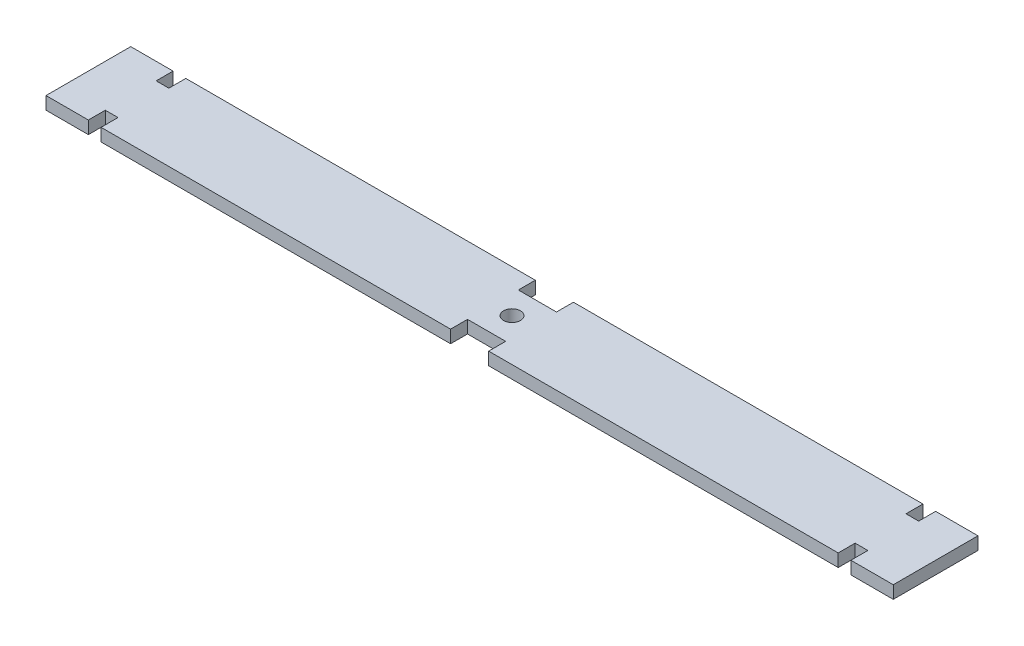
ISO-10303-21;
HEADER;
FILE_DESCRIPTION(('STEP AP214'),'2;1');
FILE_NAME('part.step','',(''),(''),'','','');
FILE_SCHEMA(('AUTOMOTIVE_DESIGN { 1 0 10303 214 1 1 1 1 }'));
ENDSEC;
DATA;
#1=APPLICATION_CONTEXT('core data for automotive mechanical design processes');
#2=APPLICATION_PROTOCOL_DEFINITION('international standard','automotive_design',2000,#1);
#3=PRODUCT_CONTEXT('',#1,'mechanical');
#4=PRODUCT('Part','Part','',(#3));
#5=PRODUCT_RELATED_PRODUCT_CATEGORY('part','',(#4));
#6=PRODUCT_DEFINITION_FORMATION('','',#4);
#7=PRODUCT_DEFINITION_CONTEXT('part definition',#1,'design');
#8=PRODUCT_DEFINITION('design','',#6,#7);
#9=PRODUCT_DEFINITION_SHAPE('','',#8);
#10=(LENGTH_UNIT() NAMED_UNIT(*) SI_UNIT(.MILLI.,.METRE.));
#11=(NAMED_UNIT(*) PLANE_ANGLE_UNIT() SI_UNIT($,.RADIAN.));
#12=(NAMED_UNIT(*) SI_UNIT($,.STERADIAN.) SOLID_ANGLE_UNIT());
#13=UNCERTAINTY_MEASURE_WITH_UNIT(LENGTH_MEASURE(1.E-05),#10,'distance_accuracy_value','');
#14=(GEOMETRIC_REPRESENTATION_CONTEXT(3) GLOBAL_UNCERTAINTY_ASSIGNED_CONTEXT((#13)) GLOBAL_UNIT_ASSIGNED_CONTEXT((#10,
#11,#12)) REPRESENTATION_CONTEXT('',''));
#15=CARTESIAN_POINT('',(0.,0.,0.));
#16=DIRECTION('',(0.,0.,1.));
#17=DIRECTION('',(1.,0.,0.));
#18=AXIS2_PLACEMENT_3D('',#15,#16,#17);
#19=CARTESIAN_POINT('',(-9.82981271411533,1.5,4.11930626589821));
#20=DIRECTION('',(0.,0.,-1.));
#21=DIRECTION('',(-1.,0.,0.));
#22=AXIS2_PLACEMENT_3D('',#19,#20,#21);
#23=PLANE('',#22);
#24=DIRECTION('',(1.,0.,0.));
#25=VECTOR('',#24,1.);
#26=CARTESIAN_POINT('',(-9.82981271411533,0.,4.11930626589821));
#27=LINE('',#26,#25);
#28=CARTESIAN_POINT('',(-9.82981271411533,0.,4.11930626589821));
#29=VERTEX_POINT('',#28);
#30=CARTESIAN_POINT('',(-4.82981271411533,0.,4.11930626589821));
#31=VERTEX_POINT('',#30);
#32=EDGE_CURVE('E287',#29,#31,#27,.T.);
#33=ORIENTED_EDGE('',*,*,#32,.T.);
#34=DIRECTION('',(0.,1.,0.));
#35=VECTOR('',#34,1.);
#36=CARTESIAN_POINT('',(-4.82981271411533,-0.5,4.11930626589821));
#37=LINE('',#36,#35);
#38=CARTESIAN_POINT('',(-4.82981271411533,1.5,4.11930626589821));
#39=VERTEX_POINT('',#38);
#40=EDGE_CURVE('E421',#31,#39,#37,.T.);
#41=ORIENTED_EDGE('',*,*,#40,.T.);
#42=DIRECTION('',(1.,0.,0.));
#43=VECTOR('',#42,1.);
#44=CARTESIAN_POINT('',(-9.82981271411533,1.5,4.11930626589821));
#45=LINE('',#44,#43);
#46=CARTESIAN_POINT('',(-9.82981271411533,1.5,4.11930626589821));
#47=VERTEX_POINT('',#46);
#48=EDGE_CURVE('E264',#47,#39,#45,.T.);
#49=ORIENTED_EDGE('',*,*,#48,.F.);
#50=DIRECTION('',(0.,-1.,0.));
#51=VECTOR('',#50,1.);
#52=CARTESIAN_POINT('',(-9.82981271411533,1.5,4.11930626589821));
#53=LINE('',#52,#51);
#54=EDGE_CURVE('E312',#47,#29,#53,.T.);
#55=ORIENTED_EDGE('',*,*,#54,.T.);
#56=EDGE_LOOP('',(#33,#41,#49,#55));
#57=FACE_BOUND('',#56,.T.);
#58=ADVANCED_FACE('F39',(#57),#23,.F.);
#59=CARTESIAN_POINT('',(-3.32981271411533,1.5,4.11930626589821));
#60=VERTEX_POINT('',#59);
#61=CARTESIAN_POINT('',(37.9201872858847,1.5,4.11930626589821));
#62=VERTEX_POINT('',#61);
#63=EDGE_CURVE('E258',#60,#62,#45,.T.);
#64=ORIENTED_EDGE('',*,*,#63,.F.);
#65=DIRECTION('',(0.,1.,0.));
#66=VECTOR('',#65,1.);
#67=CARTESIAN_POINT('',(-3.32981271411533,-0.5,4.11930626589821));
#68=LINE('',#67,#66);
#69=CARTESIAN_POINT('',(-3.32981271411533,0.,4.11930626589821));
#70=VERTEX_POINT('',#69);
#71=EDGE_CURVE('E487',#70,#60,#68,.T.);
#72=ORIENTED_EDGE('',*,*,#71,.F.);
#73=CARTESIAN_POINT('',(37.9201872858847,0.,4.11930626589821));
#74=VERTEX_POINT('',#73);
#75=EDGE_CURVE('E292',#70,#74,#27,.T.);
#76=ORIENTED_EDGE('',*,*,#75,.T.);
#77=DIRECTION('',(0.,1.,0.));
#78=VECTOR('',#77,1.);
#79=CARTESIAN_POINT('',(37.9201872858847,-0.5,4.11930626589821));
#80=LINE('',#79,#78);
#81=EDGE_CURVE('E501',#74,#62,#80,.T.);
#82=ORIENTED_EDGE('',*,*,#81,.T.);
#83=EDGE_LOOP('',(#64,#72,#76,#82));
#84=FACE_BOUND('',#83,.T.);
#85=ADVANCED_FACE('F553',(#84),#23,.F.);
#86=CARTESIAN_POINT('',(42.4201872858847,1.5,4.11930626589821));
#87=VERTEX_POINT('',#86);
#88=CARTESIAN_POINT('',(83.6701872858847,1.5,4.1193062658982));
#89=VERTEX_POINT('',#88);
#90=EDGE_CURVE('E243',#87,#89,#45,.T.);
#91=ORIENTED_EDGE('',*,*,#90,.F.);
#92=DIRECTION('',(0.,1.,0.));
#93=VECTOR('',#92,1.);
#94=CARTESIAN_POINT('',(42.4201872858847,-0.5,4.11930626589821));
#95=LINE('',#94,#93);
#96=CARTESIAN_POINT('',(42.4201872858847,0.,4.11930626589821));
#97=VERTEX_POINT('',#96);
#98=EDGE_CURVE('E507',#97,#87,#95,.T.);
#99=ORIENTED_EDGE('',*,*,#98,.F.);
#100=CARTESIAN_POINT('',(83.6701872858847,0.,4.1193062658982));
#101=VERTEX_POINT('',#100);
#102=EDGE_CURVE('E245',#97,#101,#27,.T.);
#103=ORIENTED_EDGE('',*,*,#102,.T.);
#104=DIRECTION('',(0.,1.,0.));
#105=VECTOR('',#104,1.);
#106=CARTESIAN_POINT('',(83.6701872858847,-0.5,4.1193062658982));
#107=LINE('',#106,#105);
#108=EDGE_CURVE('E227',#101,#89,#107,.T.);
#109=ORIENTED_EDGE('',*,*,#108,.T.);
#110=EDGE_LOOP('',(#91,#99,#103,#109));
#111=FACE_BOUND('',#110,.T.);
#112=ADVANCED_FACE('F241',(#111),#23,.F.);
#113=CARTESIAN_POINT('',(-9.82981271411533,1.5,-5.88069373410179));
#114=DIRECTION('',(0.,0.,1.));
#115=DIRECTION('',(1.,0.,0.));
#116=AXIS2_PLACEMENT_3D('',#113,#114,#115);
#117=PLANE('',#116);
#118=DIRECTION('',(-1.,0.,0.));
#119=VECTOR('',#118,1.);
#120=CARTESIAN_POINT('',(-9.82981271411533,1.5,-5.88069373410179));
#121=LINE('',#120,#119);
#122=CARTESIAN_POINT('',(37.9201872858847,1.5,-5.8806937341018));
#123=VERTEX_POINT('',#122);
#124=CARTESIAN_POINT('',(-3.32981271411533,1.5,-5.88069373410179));
#125=VERTEX_POINT('',#124);
#126=EDGE_CURVE('E429',#123,#125,#121,.T.);
#127=ORIENTED_EDGE('',*,*,#126,.F.);
#128=DIRECTION('',(0.,1.,0.));
#129=VECTOR('',#128,1.);
#130=CARTESIAN_POINT('',(37.9201872858847,-0.5,-5.8806937341018));
#131=LINE('',#130,#129);
#132=CARTESIAN_POINT('',(37.9201872858847,0.,-5.8806937341018));
#133=VERTEX_POINT('',#132);
#134=EDGE_CURVE('E516',#133,#123,#131,.T.);
#135=ORIENTED_EDGE('',*,*,#134,.F.);
#136=DIRECTION('',(-1.,0.,0.));
#137=VECTOR('',#136,1.);
#138=CARTESIAN_POINT('',(-9.82981271411533,0.,-5.88069373410179));
#139=LINE('',#138,#137);
#140=CARTESIAN_POINT('',(-3.32981271411533,0.,-5.88069373410179));
#141=VERTEX_POINT('',#140);
#142=EDGE_CURVE('E400',#133,#141,#139,.T.);
#143=ORIENTED_EDGE('',*,*,#142,.T.);
#144=DIRECTION('',(0.,1.,0.));
#145=VECTOR('',#144,1.);
#146=CARTESIAN_POINT('',(-3.32981271411533,-0.5,-5.88069373410179));
#147=LINE('',#146,#145);
#148=EDGE_CURVE('E526',#141,#125,#147,.T.);
#149=ORIENTED_EDGE('',*,*,#148,.T.);
#150=EDGE_LOOP('',(#127,#135,#143,#149));
#151=FACE_BOUND('',#150,.T.);
#152=ADVANCED_FACE('F550',(#151),#117,.F.);
#153=CARTESIAN_POINT('',(83.6701872858847,0.,-5.88069373410181));
#154=VERTEX_POINT('',#153);
#155=CARTESIAN_POINT('',(42.4201872858847,0.,-5.8806937341018));
#156=VERTEX_POINT('',#155);
#157=EDGE_CURVE('E300',#154,#156,#139,.T.);
#158=ORIENTED_EDGE('',*,*,#157,.T.);
#159=DIRECTION('',(0.,1.,0.));
#160=VECTOR('',#159,1.);
#161=CARTESIAN_POINT('',(42.4201872858847,-0.5,-5.8806937341018));
#162=LINE('',#161,#160);
#163=CARTESIAN_POINT('',(42.4201872858847,1.5,-5.8806937341018));
#164=VERTEX_POINT('',#163);
#165=EDGE_CURVE('E396',#156,#164,#162,.T.);
#166=ORIENTED_EDGE('',*,*,#165,.T.);
#167=CARTESIAN_POINT('',(83.6701872858847,1.5,-5.88069373410181));
#168=VERTEX_POINT('',#167);
#169=EDGE_CURVE('E280',#168,#164,#121,.T.);
#170=ORIENTED_EDGE('',*,*,#169,.F.);
#171=DIRECTION('',(0.,1.,0.));
#172=VECTOR('',#171,1.);
#173=CARTESIAN_POINT('',(83.6701872858847,-0.5,-5.88069373410181));
#174=LINE('',#173,#172);
#175=EDGE_CURVE('E398',#154,#168,#174,.T.);
#176=ORIENTED_EDGE('',*,*,#175,.F.);
#177=EDGE_LOOP('',(#158,#166,#170,#176));
#178=FACE_BOUND('',#177,.T.);
#179=ADVANCED_FACE('F394',(#178),#117,.F.);
#180=CARTESIAN_POINT('',(-4.82981271411533,1.5,-5.88069373410179));
#181=VERTEX_POINT('',#180);
#182=CARTESIAN_POINT('',(-9.82981271411533,1.5,-5.88069373410179));
#183=VERTEX_POINT('',#182);
#184=EDGE_CURVE('E274',#181,#183,#121,.T.);
#185=ORIENTED_EDGE('',*,*,#184,.F.);
#186=DIRECTION('',(0.,1.,0.));
#187=VECTOR('',#186,1.);
#188=CARTESIAN_POINT('',(-4.82981271411533,-0.5,-5.88069373410179));
#189=LINE('',#188,#187);
#190=CARTESIAN_POINT('',(-4.82981271411533,0.,-5.88069373410179));
#191=VERTEX_POINT('',#190);
#192=EDGE_CURVE('E414',#191,#181,#189,.T.);
#193=ORIENTED_EDGE('',*,*,#192,.F.);
#194=CARTESIAN_POINT('',(-9.82981271411533,0.,-5.88069373410179));
#195=VERTEX_POINT('',#194);
#196=EDGE_CURVE('E295',#191,#195,#139,.T.);
#197=ORIENTED_EDGE('',*,*,#196,.T.);
#198=DIRECTION('',(0.,-1.,0.));
#199=VECTOR('',#198,1.);
#200=CARTESIAN_POINT('',(-9.82981271411533,1.5,-5.88069373410179));
#201=LINE('',#200,#199);
#202=EDGE_CURVE('E279',#183,#195,#201,.T.);
#203=ORIENTED_EDGE('',*,*,#202,.F.);
#204=EDGE_LOOP('',(#185,#193,#197,#203));
#205=FACE_BOUND('',#204,.T.);
#206=ADVANCED_FACE('F412',(#205),#117,.F.);
#207=CARTESIAN_POINT('',(-9.82981271411533,1.5,-5.88069373410179));
#208=DIRECTION('',(1.,0.,0.));
#209=DIRECTION('',(0.,0.,-1.));
#210=AXIS2_PLACEMENT_3D('',#207,#208,#209);
#211=PLANE('',#210);
#212=DIRECTION('',(0.,0.,1.));
#213=VECTOR('',#212,1.);
#214=CARTESIAN_POINT('',(-9.82981271411533,0.,-5.88069373410179));
#215=LINE('',#214,#213);
#216=EDGE_CURVE('E281',#195,#29,#215,.T.);
#217=ORIENTED_EDGE('',*,*,#216,.T.);
#218=ORIENTED_EDGE('',*,*,#54,.F.);
#219=DIRECTION('',(0.,0.,1.));
#220=VECTOR('',#219,1.);
#221=CARTESIAN_POINT('',(-9.82981271411533,1.5,-5.88069373410179));
#222=LINE('',#221,#220);
#223=EDGE_CURVE('E265',#183,#47,#222,.T.);
#224=ORIENTED_EDGE('',*,*,#223,.F.);
#225=ORIENTED_EDGE('',*,*,#202,.T.);
#226=EDGE_LOOP('',(#217,#218,#224,#225));
#227=FACE_BOUND('',#226,.T.);
#228=ADVANCED_FACE('F41',(#227),#211,.F.);
#229=CARTESIAN_POINT('',(85.1701872858847,1.5,4.11930626589821));
#230=VERTEX_POINT('',#229);
#231=CARTESIAN_POINT('',(90.1701872858847,1.5,4.11930626589821));
#232=VERTEX_POINT('',#231);
#233=EDGE_CURVE('E259',#230,#232,#45,.T.);
#234=ORIENTED_EDGE('',*,*,#233,.F.);
#235=DIRECTION('',(0.,1.,0.));
#236=VECTOR('',#235,1.);
#237=CARTESIAN_POINT('',(85.1701872858847,-0.5,4.11930626589821));
#238=LINE('',#237,#236);
#239=CARTESIAN_POINT('',(85.1701872858847,0.,4.11930626589821));
#240=VERTEX_POINT('',#239);
#241=EDGE_CURVE('E247',#240,#230,#238,.T.);
#242=ORIENTED_EDGE('',*,*,#241,.F.);
#243=CARTESIAN_POINT('',(90.1701872858847,0.,4.11930626589821));
#244=VERTEX_POINT('',#243);
#245=EDGE_CURVE('E285',#240,#244,#27,.T.);
#246=ORIENTED_EDGE('',*,*,#245,.T.);
#247=DIRECTION('',(0.,-1.,0.));
#248=VECTOR('',#247,1.);
#249=CARTESIAN_POINT('',(90.1701872858847,1.5,4.11930626589821));
#250=LINE('',#249,#248);
#251=EDGE_CURVE('E308',#232,#244,#250,.T.);
#252=ORIENTED_EDGE('',*,*,#251,.F.);
#253=EDGE_LOOP('',(#234,#242,#246,#252));
#254=FACE_BOUND('',#253,.T.);
#255=ADVANCED_FACE('F554',(#254),#23,.F.);
#256=CARTESIAN_POINT('',(90.1701872858847,1.5,-5.88069373410179));
#257=DIRECTION('',(-1.,0.,0.));
#258=DIRECTION('',(0.,0.,1.));
#259=AXIS2_PLACEMENT_3D('',#256,#257,#258);
#260=PLANE('',#259);
#261=DIRECTION('',(0.,0.,-1.));
#262=VECTOR('',#261,1.);
#263=CARTESIAN_POINT('',(90.1701872858847,0.,-5.88069373410179));
#264=LINE('',#263,#262);
#265=CARTESIAN_POINT('',(90.1701872858847,0.,-5.88069373410179));
#266=VERTEX_POINT('',#265);
#267=EDGE_CURVE('E291',#244,#266,#264,.T.);
#268=ORIENTED_EDGE('',*,*,#267,.T.);
#269=DIRECTION('',(0.,-1.,0.));
#270=VECTOR('',#269,1.);
#271=CARTESIAN_POINT('',(90.1701872858847,1.5,-5.88069373410179));
#272=LINE('',#271,#270);
#273=CARTESIAN_POINT('',(90.1701872858847,1.5,-5.88069373410179));
#274=VERTEX_POINT('',#273);
#275=EDGE_CURVE('E304',#274,#266,#272,.T.);
#276=ORIENTED_EDGE('',*,*,#275,.F.);
#277=DIRECTION('',(0.,0.,-1.));
#278=VECTOR('',#277,1.);
#279=CARTESIAN_POINT('',(90.1701872858847,1.5,-5.88069373410179));
#280=LINE('',#279,#278);
#281=EDGE_CURVE('E270',#232,#274,#280,.T.);
#282=ORIENTED_EDGE('',*,*,#281,.F.);
#283=ORIENTED_EDGE('',*,*,#251,.T.);
#284=EDGE_LOOP('',(#268,#276,#282,#283));
#285=FACE_BOUND('',#284,.T.);
#286=ADVANCED_FACE('F547',(#285),#260,.F.);
#287=CARTESIAN_POINT('',(85.1701872858847,0.,-5.88069373410181));
#288=VERTEX_POINT('',#287);
#289=EDGE_CURVE('E296',#266,#288,#139,.T.);
#290=ORIENTED_EDGE('',*,*,#289,.T.);
#291=DIRECTION('',(0.,1.,0.));
#292=VECTOR('',#291,1.);
#293=CARTESIAN_POINT('',(85.1701872858847,-0.5,-5.88069373410181));
#294=LINE('',#293,#292);
#295=CARTESIAN_POINT('',(85.1701872858847,1.5,-5.88069373410181));
#296=VERTEX_POINT('',#295);
#297=EDGE_CURVE('E465',#288,#296,#294,.T.);
#298=ORIENTED_EDGE('',*,*,#297,.T.);
#299=EDGE_CURVE('E275',#274,#296,#121,.T.);
#300=ORIENTED_EDGE('',*,*,#299,.F.);
#301=ORIENTED_EDGE('',*,*,#275,.T.);
#302=EDGE_LOOP('',(#290,#298,#300,#301));
#303=FACE_BOUND('',#302,.T.);
#304=ADVANCED_FACE('F540',(#303),#117,.F.);
#305=CARTESIAN_POINT('',(0.,1.5,0.));
#306=DIRECTION('',(0.,1.,0.));
#307=DIRECTION('',(0.,0.,1.));
#308=AXIS2_PLACEMENT_3D('',#305,#306,#307);
#309=PLANE('',#308);
#310=DIRECTION('',(0.,0.,1.));
#311=VECTOR('',#310,1.);
#312=CARTESIAN_POINT('',(37.9201872858847,1.5,-5.8806937341018));
#313=LINE('',#312,#311);
#314=CARTESIAN_POINT('',(37.9201872858847,1.5,-3.88069373410181));
#315=VERTEX_POINT('',#314);
#316=EDGE_CURVE('E464',#123,#315,#313,.T.);
#317=ORIENTED_EDGE('',*,*,#316,.F.);
#318=ORIENTED_EDGE('',*,*,#126,.T.);
#319=DIRECTION('',(0.,0.,-1.));
#320=VECTOR('',#319,1.);
#321=CARTESIAN_POINT('',(-3.32981271411533,1.5,-5.88069373410179));
#322=LINE('',#321,#320);
#323=CARTESIAN_POINT('',(-3.32981271411533,1.5,-3.88069373410181));
#324=VERTEX_POINT('',#323);
#325=EDGE_CURVE('E520',#324,#125,#322,.T.);
#326=ORIENTED_EDGE('',*,*,#325,.F.);
#327=DIRECTION('',(1.,0.,0.));
#328=VECTOR('',#327,1.);
#329=CARTESIAN_POINT('',(-4.82981271411533,1.5,-3.88069373410179));
#330=LINE('',#329,#328);
#331=CARTESIAN_POINT('',(-4.82981271411533,1.5,-3.88069373410179));
#332=VERTEX_POINT('',#331);
#333=EDGE_CURVE('E515',#332,#324,#330,.T.);
#334=ORIENTED_EDGE('',*,*,#333,.F.);
#335=DIRECTION('',(0.,0.,1.));
#336=VECTOR('',#335,1.);
#337=CARTESIAN_POINT('',(-4.82981271411533,1.5,-5.88069373410179));
#338=LINE('',#337,#336);
#339=EDGE_CURVE('E427',#181,#332,#338,.T.);
#340=ORIENTED_EDGE('',*,*,#339,.F.);
#341=ORIENTED_EDGE('',*,*,#184,.T.);
#342=ORIENTED_EDGE('',*,*,#223,.T.);
#343=ORIENTED_EDGE('',*,*,#48,.T.);
#344=DIRECTION('',(0.,0.,1.));
#345=VECTOR('',#344,1.);
#346=CARTESIAN_POINT('',(-4.82981271411533,1.5,4.11930626589821));
#347=LINE('',#346,#345);
#348=CARTESIAN_POINT('',(-4.82981271411533,1.5,2.11930626589821));
#349=VERTEX_POINT('',#348);
#350=EDGE_CURVE('E473',#349,#39,#347,.T.);
#351=ORIENTED_EDGE('',*,*,#350,.F.);
#352=DIRECTION('',(-1.,0.,0.));
#353=VECTOR('',#352,1.);
#354=CARTESIAN_POINT('',(-4.82981271411533,1.5,2.11930626589821));
#355=LINE('',#354,#353);
#356=CARTESIAN_POINT('',(-3.32981271411533,1.5,2.11930626589821));
#357=VERTEX_POINT('',#356);
#358=EDGE_CURVE('E481',#357,#349,#355,.T.);
#359=ORIENTED_EDGE('',*,*,#358,.F.);
#360=DIRECTION('',(0.,0.,-1.));
#361=VECTOR('',#360,1.);
#362=CARTESIAN_POINT('',(-3.32981271411533,1.5,4.11930626589821));
#363=LINE('',#362,#361);
#364=EDGE_CURVE('E476',#60,#357,#363,.T.);
#365=ORIENTED_EDGE('',*,*,#364,.F.);
#366=ORIENTED_EDGE('',*,*,#63,.T.);
#367=DIRECTION('',(0.,0.,1.));
#368=VECTOR('',#367,1.);
#369=CARTESIAN_POINT('',(37.9201872858847,1.5,4.11930626589821));
#370=LINE('',#369,#368);
#371=CARTESIAN_POINT('',(37.9201872858847,1.5,2.11930626589821));
#372=VERTEX_POINT('',#371);
#373=EDGE_CURVE('E492',#372,#62,#370,.T.);
#374=ORIENTED_EDGE('',*,*,#373,.F.);
#375=DIRECTION('',(-1.,0.,0.));
#376=VECTOR('',#375,1.);
#377=CARTESIAN_POINT('',(37.9201872858847,1.5,2.11930626589821));
#378=LINE('',#377,#376);
#379=CARTESIAN_POINT('',(42.4201872858847,1.5,2.11930626589821));
#380=VERTEX_POINT('',#379);
#381=EDGE_CURVE('E497',#380,#372,#378,.T.);
#382=ORIENTED_EDGE('',*,*,#381,.F.);
#383=DIRECTION('',(0.,0.,-1.));
#384=VECTOR('',#383,1.);
#385=CARTESIAN_POINT('',(42.4201872858847,1.5,4.11930626589821));
#386=LINE('',#385,#384);
#387=EDGE_CURVE('E256',#87,#380,#386,.T.);
#388=ORIENTED_EDGE('',*,*,#387,.F.);
#389=ORIENTED_EDGE('',*,*,#90,.T.);
#390=DIRECTION('',(0.,0.,1.));
#391=VECTOR('',#390,1.);
#392=CARTESIAN_POINT('',(83.6701872858847,1.5,4.1193062658982));
#393=LINE('',#392,#391);
#394=CARTESIAN_POINT('',(83.6701872858847,1.5,2.11930626589821));
#395=VERTEX_POINT('',#394);
#396=EDGE_CURVE('E224',#395,#89,#393,.T.);
#397=ORIENTED_EDGE('',*,*,#396,.F.);
#398=DIRECTION('',(-1.,0.,0.));
#399=VECTOR('',#398,1.);
#400=CARTESIAN_POINT('',(83.6701872858847,1.5,2.11930626589821));
#401=LINE('',#400,#399);
#402=CARTESIAN_POINT('',(85.1701872858847,1.5,2.11930626589821));
#403=VERTEX_POINT('',#402);
#404=EDGE_CURVE('E248',#403,#395,#401,.T.);
#405=ORIENTED_EDGE('',*,*,#404,.F.);
#406=DIRECTION('',(0.,0.,-1.));
#407=VECTOR('',#406,1.);
#408=CARTESIAN_POINT('',(85.1701872858847,1.5,4.11930626589821));
#409=LINE('',#408,#407);
#410=EDGE_CURVE('E236',#230,#403,#409,.T.);
#411=ORIENTED_EDGE('',*,*,#410,.F.);
#412=ORIENTED_EDGE('',*,*,#233,.T.);
#413=ORIENTED_EDGE('',*,*,#281,.T.);
#414=ORIENTED_EDGE('',*,*,#299,.T.);
#415=DIRECTION('',(0.,0.,-1.));
#416=VECTOR('',#415,1.);
#417=CARTESIAN_POINT('',(85.1701872858847,1.5,-5.88069373410181));
#418=LINE('',#417,#416);
#419=CARTESIAN_POINT('',(85.1701872858847,1.5,-3.88069373410181));
#420=VERTEX_POINT('',#419);
#421=EDGE_CURVE('E451',#420,#296,#418,.T.);
#422=ORIENTED_EDGE('',*,*,#421,.F.);
#423=DIRECTION('',(1.,0.,0.));
#424=VECTOR('',#423,1.);
#425=CARTESIAN_POINT('',(83.6701872858847,1.5,-3.88069373410181));
#426=LINE('',#425,#424);
#427=CARTESIAN_POINT('',(83.6701872858847,1.5,-3.88069373410181));
#428=VERTEX_POINT('',#427);
#429=EDGE_CURVE('E443',#428,#420,#426,.T.);
#430=ORIENTED_EDGE('',*,*,#429,.F.);
#431=DIRECTION('',(0.,0.,1.));
#432=VECTOR('',#431,1.);
#433=CARTESIAN_POINT('',(83.6701872858847,1.5,-5.88069373410181));
#434=LINE('',#433,#432);
#435=EDGE_CURVE('E441',#168,#428,#434,.T.);
#436=ORIENTED_EDGE('',*,*,#435,.F.);
#437=ORIENTED_EDGE('',*,*,#169,.T.);
#438=DIRECTION('',(0.,0.,-1.));
#439=VECTOR('',#438,1.);
#440=CARTESIAN_POINT('',(42.4201872858847,1.5,-5.8806937341018));
#441=LINE('',#440,#439);
#442=CARTESIAN_POINT('',(42.4201872858847,1.5,-3.88069373410181));
#443=VERTEX_POINT('',#442);
#444=EDGE_CURVE('E438',#443,#164,#441,.T.);
#445=ORIENTED_EDGE('',*,*,#444,.F.);
#446=DIRECTION('',(1.,0.,0.));
#447=VECTOR('',#446,1.);
#448=CARTESIAN_POINT('',(37.9201872858847,1.5,-3.88069373410181));
#449=LINE('',#448,#447);
#450=EDGE_CURVE('E667',#315,#443,#449,.T.);
#451=ORIENTED_EDGE('',*,*,#450,.F.);
#452=EDGE_LOOP('',(#317,#318,#326,#334,#340,#341,#342,#343,#351,#359,#365,#366,#374,#382,#388,
#389,#397,#405,#411,#412,#413,#414,#422,#430,#436,#437,#445,#451));
#453=FACE_BOUND('',#452,.T.);
#454=CARTESIAN_POINT('',(40.1701872858847,1.5,-0.880693734101789));
#455=DIRECTION('',(0.,1.,0.));
#456=DIRECTION('',(0.,0.,1.));
#457=AXIS2_PLACEMENT_3D('',#454,#455,#456);
#458=CIRCLE('',#457,0.999999999999998);
#459=CARTESIAN_POINT('',(40.1701872858847,1.5,0.119306265898209));
#460=VERTEX_POINT('',#459);
#461=EDGE_CURVE('E320',#460,#460,#458,.T.);
#462=ORIENTED_EDGE('',*,*,#461,.F.);
#463=EDGE_LOOP('',(#462));
#464=FACE_BOUND('',#463,.T.);
#465=ADVANCED_FACE('F252',(#453,#464),#309,.T.);
#466=CARTESIAN_POINT('',(0.,0.,0.));
#467=DIRECTION('',(0.,1.,0.));
#468=DIRECTION('',(0.,0.,1.));
#469=AXIS2_PLACEMENT_3D('',#466,#467,#468);
#470=PLANE('',#469);
#471=ORIENTED_EDGE('',*,*,#142,.F.);
#472=DIRECTION('',(0.,0.,1.));
#473=VECTOR('',#472,1.);
#474=CARTESIAN_POINT('',(37.9201872858847,0.,0.));
#475=LINE('',#474,#473);
#476=CARTESIAN_POINT('',(37.9201872858847,0.,-3.88069373410181));
#477=VERTEX_POINT('',#476);
#478=EDGE_CURVE('E11',#133,#477,#475,.T.);
#479=ORIENTED_EDGE('',*,*,#478,.T.);
#480=DIRECTION('',(1.,0.,0.));
#481=VECTOR('',#480,1.);
#482=CARTESIAN_POINT('',(0.,0.,-3.88069373410181));
#483=LINE('',#482,#481);
#484=CARTESIAN_POINT('',(42.4201872858847,0.,-3.88069373410181));
#485=VERTEX_POINT('',#484);
#486=EDGE_CURVE('E379',#477,#485,#483,.T.);
#487=ORIENTED_EDGE('',*,*,#486,.T.);
#488=DIRECTION('',(0.,0.,-1.));
#489=VECTOR('',#488,1.);
#490=CARTESIAN_POINT('',(42.4201872858847,0.,0.));
#491=LINE('',#490,#489);
#492=EDGE_CURVE('E48',#485,#156,#491,.T.);
#493=ORIENTED_EDGE('',*,*,#492,.T.);
#494=ORIENTED_EDGE('',*,*,#157,.F.);
#495=DIRECTION('',(0.,0.,1.));
#496=VECTOR('',#495,1.);
#497=CARTESIAN_POINT('',(83.6701872858847,0.,0.));
#498=LINE('',#497,#496);
#499=CARTESIAN_POINT('',(83.6701872858847,0.,-3.88069373410181));
#500=VERTEX_POINT('',#499);
#501=EDGE_CURVE('E375',#154,#500,#498,.T.);
#502=ORIENTED_EDGE('',*,*,#501,.T.);
#503=DIRECTION('',(1.,0.,0.));
#504=VECTOR('',#503,1.);
#505=CARTESIAN_POINT('',(0.,0.,-3.88069373410201));
#506=LINE('',#505,#504);
#507=CARTESIAN_POINT('',(85.1701872858847,0.,-3.88069373410181));
#508=VERTEX_POINT('',#507);
#509=EDGE_CURVE('E367',#500,#508,#506,.T.);
#510=ORIENTED_EDGE('',*,*,#509,.T.);
#511=DIRECTION('',(0.,0.,-1.));
#512=VECTOR('',#511,1.);
#513=CARTESIAN_POINT('',(85.1701872858847,0.,0.));
#514=LINE('',#513,#512);
#515=EDGE_CURVE('E371',#508,#288,#514,.T.);
#516=ORIENTED_EDGE('',*,*,#515,.T.);
#517=ORIENTED_EDGE('',*,*,#289,.F.);
#518=ORIENTED_EDGE('',*,*,#267,.F.);
#519=ORIENTED_EDGE('',*,*,#245,.F.);
#520=DIRECTION('',(0.,0.,-1.));
#521=VECTOR('',#520,1.);
#522=CARTESIAN_POINT('',(85.1701872858847,0.,0.));
#523=LINE('',#522,#521);
#524=CARTESIAN_POINT('',(85.1701872858847,0.,2.11930626589821));
#525=VERTEX_POINT('',#524);
#526=EDGE_CURVE('E332',#240,#525,#523,.T.);
#527=ORIENTED_EDGE('',*,*,#526,.T.);
#528=DIRECTION('',(-1.,0.,0.));
#529=VECTOR('',#528,1.);
#530=CARTESIAN_POINT('',(0.,0.,2.11930626589821));
#531=LINE('',#530,#529);
#532=CARTESIAN_POINT('',(83.6701872858847,0.,2.11930626589821));
#533=VERTEX_POINT('',#532);
#534=EDGE_CURVE('E336',#525,#533,#531,.T.);
#535=ORIENTED_EDGE('',*,*,#534,.T.);
#536=DIRECTION('',(0.,0.,1.));
#537=VECTOR('',#536,1.);
#538=CARTESIAN_POINT('',(83.6701872858847,0.,0.));
#539=LINE('',#538,#537);
#540=EDGE_CURVE('E340',#533,#101,#539,.T.);
#541=ORIENTED_EDGE('',*,*,#540,.T.);
#542=ORIENTED_EDGE('',*,*,#102,.F.);
#543=DIRECTION('',(0.,0.,-1.));
#544=VECTOR('',#543,1.);
#545=CARTESIAN_POINT('',(42.4201872858847,0.,0.));
#546=LINE('',#545,#544);
#547=CARTESIAN_POINT('',(42.4201872858847,0.,2.11930626589821));
#548=VERTEX_POINT('',#547);
#549=EDGE_CURVE('E343',#97,#548,#546,.T.);
#550=ORIENTED_EDGE('',*,*,#549,.T.);
#551=DIRECTION('',(-1.,0.,0.));
#552=VECTOR('',#551,1.);
#553=CARTESIAN_POINT('',(0.,0.,2.11930626589821));
#554=LINE('',#553,#552);
#555=CARTESIAN_POINT('',(37.9201872858847,0.,2.11930626589821));
#556=VERTEX_POINT('',#555);
#557=EDGE_CURVE('E347',#548,#556,#554,.T.);
#558=ORIENTED_EDGE('',*,*,#557,.T.);
#559=DIRECTION('',(0.,0.,1.));
#560=VECTOR('',#559,1.);
#561=CARTESIAN_POINT('',(37.9201872858847,0.,0.));
#562=LINE('',#561,#560);
#563=EDGE_CURVE('E351',#556,#74,#562,.T.);
#564=ORIENTED_EDGE('',*,*,#563,.T.);
#565=ORIENTED_EDGE('',*,*,#75,.F.);
#566=DIRECTION('',(0.,0.,-1.));
#567=VECTOR('',#566,1.);
#568=CARTESIAN_POINT('',(-3.32981271411533,0.,0.));
#569=LINE('',#568,#567);
#570=CARTESIAN_POINT('',(-3.32981271411533,0.,2.11930626589821));
#571=VERTEX_POINT('',#570);
#572=EDGE_CURVE('E355',#70,#571,#569,.T.);
#573=ORIENTED_EDGE('',*,*,#572,.T.);
#574=DIRECTION('',(-1.,0.,0.));
#575=VECTOR('',#574,1.);
#576=CARTESIAN_POINT('',(0.,0.,2.11930626589821));
#577=LINE('',#576,#575);
#578=CARTESIAN_POINT('',(-4.82981271411533,0.,2.11930626589821));
#579=VERTEX_POINT('',#578);
#580=EDGE_CURVE('E359',#571,#579,#577,.T.);
#581=ORIENTED_EDGE('',*,*,#580,.T.);
#582=DIRECTION('',(0.,0.,1.));
#583=VECTOR('',#582,1.);
#584=CARTESIAN_POINT('',(-4.82981271411533,0.,0.));
#585=LINE('',#584,#583);
#586=EDGE_CURVE('E363',#579,#31,#585,.T.);
#587=ORIENTED_EDGE('',*,*,#586,.T.);
#588=ORIENTED_EDGE('',*,*,#32,.F.);
#589=ORIENTED_EDGE('',*,*,#216,.F.);
#590=ORIENTED_EDGE('',*,*,#196,.F.);
#591=DIRECTION('',(0.,0.,1.));
#592=VECTOR('',#591,1.);
#593=CARTESIAN_POINT('',(-4.82981271411534,0.,0.));
#594=LINE('',#593,#592);
#595=CARTESIAN_POINT('',(-4.82981271411533,0.,-3.88069373410179));
#596=VERTEX_POINT('',#595);
#597=EDGE_CURVE('E328',#191,#596,#594,.T.);
#598=ORIENTED_EDGE('',*,*,#597,.T.);
#599=DIRECTION('',(1.,0.,0.));
#600=VECTOR('',#599,1.);
#601=CARTESIAN_POINT('',(0.,0.,-3.88069373410186));
#602=LINE('',#601,#600);
#603=CARTESIAN_POINT('',(-3.32981271411533,0.,-3.88069373410181));
#604=VERTEX_POINT('',#603);
#605=EDGE_CURVE('E316',#596,#604,#602,.T.);
#606=ORIENTED_EDGE('',*,*,#605,.T.);
#607=DIRECTION('',(0.,0.,-1.));
#608=VECTOR('',#607,1.);
#609=CARTESIAN_POINT('',(-3.32981271411533,0.,0.));
#610=LINE('',#609,#608);
#611=EDGE_CURVE('E324',#604,#141,#610,.T.);
#612=ORIENTED_EDGE('',*,*,#611,.T.);
#613=EDGE_LOOP('',(#471,#479,#487,#493,#494,#502,#510,#516,#517,#518,#519,#527,#535,#541,#542,
#550,#558,#564,#565,#573,#581,#587,#588,#589,#590,#598,#606,#612));
#614=FACE_BOUND('',#613,.T.);
#615=CARTESIAN_POINT('',(40.1701872858847,0.,-0.880693734101789));
#616=DIRECTION('',(0.,1.,0.));
#617=DIRECTION('',(0.,0.,1.));
#618=AXIS2_PLACEMENT_3D('',#615,#616,#617);
#619=CIRCLE('',#618,0.999999999999998);
#620=CARTESIAN_POINT('',(40.1701872858847,0.,0.119306265898209));
#621=VERTEX_POINT('',#620);
#622=EDGE_CURVE('E286',#621,#621,#619,.T.);
#623=ORIENTED_EDGE('',*,*,#622,.T.);
#624=EDGE_LOOP('',(#623));
#625=FACE_BOUND('',#624,.T.);
#626=ADVANCED_FACE('F388',(#614,#625),#470,.F.);
#627=CARTESIAN_POINT('',(40.1701872858847,-0.5,-0.880693734101789));
#628=DIRECTION('',(0.,1.,0.));
#629=DIRECTION('',(0.,0.,1.));
#630=AXIS2_PLACEMENT_3D('',#627,#628,#629);
#631=CYLINDRICAL_SURFACE('',#630,0.999999999999998);
#632=ORIENTED_EDGE('',*,*,#461,.T.);
#633=EDGE_LOOP('',(#632));
#634=FACE_BOUND('',#633,.T.);
#635=ORIENTED_EDGE('',*,*,#622,.F.);
#636=EDGE_LOOP('',(#635));
#637=FACE_BOUND('',#636,.T.);
#638=ADVANCED_FACE('F537',(#634,#637),#631,.F.);
#639=CARTESIAN_POINT('',(-4.82981271411533,-0.5,-5.88069373410179));
#640=DIRECTION('',(-1.,0.,0.));
#641=DIRECTION('',(0.,0.,1.));
#642=AXIS2_PLACEMENT_3D('',#639,#640,#641);
#643=PLANE('',#642);
#644=ORIENTED_EDGE('',*,*,#192,.T.);
#645=ORIENTED_EDGE('',*,*,#339,.T.);
#646=DIRECTION('',(0.,1.,0.));
#647=VECTOR('',#646,1.);
#648=CARTESIAN_POINT('',(-4.82981271411533,-0.5,-3.88069373410179));
#649=LINE('',#648,#647);
#650=EDGE_CURVE('E523',#596,#332,#649,.T.);
#651=ORIENTED_EDGE('',*,*,#650,.F.);
#652=ORIENTED_EDGE('',*,*,#597,.F.);
#653=EDGE_LOOP('',(#644,#645,#651,#652));
#654=FACE_BOUND('',#653,.T.);
#655=ADVANCED_FACE('F582',(#654),#643,.F.);
#656=CARTESIAN_POINT('',(-3.32981271411533,-0.5,-5.88069373410179));
#657=DIRECTION('',(1.,0.,0.));
#658=DIRECTION('',(0.,0.,-1.));
#659=AXIS2_PLACEMENT_3D('',#656,#657,#658);
#660=PLANE('',#659);
#661=DIRECTION('',(0.,1.,0.));
#662=VECTOR('',#661,1.);
#663=CARTESIAN_POINT('',(-3.32981271411533,-0.5,-3.88069373410181));
#664=LINE('',#663,#662);
#665=EDGE_CURVE('E529',#604,#324,#664,.T.);
#666=ORIENTED_EDGE('',*,*,#665,.T.);
#667=ORIENTED_EDGE('',*,*,#325,.T.);
#668=ORIENTED_EDGE('',*,*,#148,.F.);
#669=ORIENTED_EDGE('',*,*,#611,.F.);
#670=EDGE_LOOP('',(#666,#667,#668,#669));
#671=FACE_BOUND('',#670,.T.);
#672=ADVANCED_FACE('F577',(#671),#660,.F.);
#673=CARTESIAN_POINT('',(-4.82981271411533,-0.5,-3.88069373410179));
#674=DIRECTION('',(0.,0.,1.));
#675=DIRECTION('',(1.,0.,0.));
#676=AXIS2_PLACEMENT_3D('',#673,#674,#675);
#677=PLANE('',#676);
#678=ORIENTED_EDGE('',*,*,#650,.T.);
#679=ORIENTED_EDGE('',*,*,#333,.T.);
#680=ORIENTED_EDGE('',*,*,#665,.F.);
#681=ORIENTED_EDGE('',*,*,#605,.F.);
#682=EDGE_LOOP('',(#678,#679,#680,#681));
#683=FACE_BOUND('',#682,.T.);
#684=ADVANCED_FACE('F580',(#683),#677,.F.);
#685=CARTESIAN_POINT('',(83.6701872858847,-0.5,4.1193062658982));
#686=DIRECTION('',(-1.,0.,0.));
#687=DIRECTION('',(0.,0.,1.));
#688=AXIS2_PLACEMENT_3D('',#685,#686,#687);
#689=PLANE('',#688);
#690=DIRECTION('',(0.,1.,0.));
#691=VECTOR('',#690,1.);
#692=CARTESIAN_POINT('',(83.6701872858847,-0.5,2.11930626589821));
#693=LINE('',#692,#691);
#694=EDGE_CURVE('E230',#533,#395,#693,.T.);
#695=ORIENTED_EDGE('',*,*,#694,.T.);
#696=ORIENTED_EDGE('',*,*,#396,.T.);
#697=ORIENTED_EDGE('',*,*,#108,.F.);
#698=ORIENTED_EDGE('',*,*,#540,.F.);
#699=EDGE_LOOP('',(#695,#696,#697,#698));
#700=FACE_BOUND('',#699,.T.);
#701=ADVANCED_FACE('F226',(#700),#689,.F.);
#702=CARTESIAN_POINT('',(83.6701872858847,-0.5,2.11930626589821));
#703=DIRECTION('',(0.,0.,-1.));
#704=DIRECTION('',(-1.,0.,0.));
#705=AXIS2_PLACEMENT_3D('',#702,#703,#704);
#706=PLANE('',#705);
#707=DIRECTION('',(0.,1.,0.));
#708=VECTOR('',#707,1.);
#709=CARTESIAN_POINT('',(85.1701872858847,-0.5,2.11930626589821));
#710=LINE('',#709,#708);
#711=EDGE_CURVE('E649',#525,#403,#710,.T.);
#712=ORIENTED_EDGE('',*,*,#711,.T.);
#713=ORIENTED_EDGE('',*,*,#404,.T.);
#714=ORIENTED_EDGE('',*,*,#694,.F.);
#715=ORIENTED_EDGE('',*,*,#534,.F.);
#716=EDGE_LOOP('',(#712,#713,#714,#715));
#717=FACE_BOUND('',#716,.T.);
#718=ADVANCED_FACE('F640',(#717),#706,.F.);
#719=CARTESIAN_POINT('',(85.1701872858847,-0.5,4.11930626589821));
#720=DIRECTION('',(1.,0.,0.));
#721=DIRECTION('',(0.,0.,-1.));
#722=AXIS2_PLACEMENT_3D('',#719,#720,#721);
#723=PLANE('',#722);
#724=ORIENTED_EDGE('',*,*,#241,.T.);
#725=ORIENTED_EDGE('',*,*,#410,.T.);
#726=ORIENTED_EDGE('',*,*,#711,.F.);
#727=ORIENTED_EDGE('',*,*,#526,.F.);
#728=EDGE_LOOP('',(#724,#725,#726,#727));
#729=FACE_BOUND('',#728,.T.);
#730=ADVANCED_FACE('F597',(#729),#723,.F.);
#731=CARTESIAN_POINT('',(37.9201872858847,-0.5,4.11930626589821));
#732=DIRECTION('',(-1.,0.,0.));
#733=DIRECTION('',(0.,0.,1.));
#734=AXIS2_PLACEMENT_3D('',#731,#732,#733);
#735=PLANE('',#734);
#736=DIRECTION('',(0.,1.,0.));
#737=VECTOR('',#736,1.);
#738=CARTESIAN_POINT('',(37.9201872858847,-0.5,2.11930626589821));
#739=LINE('',#738,#737);
#740=EDGE_CURVE('E477',#556,#372,#739,.T.);
#741=ORIENTED_EDGE('',*,*,#740,.T.);
#742=ORIENTED_EDGE('',*,*,#373,.T.);
#743=ORIENTED_EDGE('',*,*,#81,.F.);
#744=ORIENTED_EDGE('',*,*,#563,.F.);
#745=EDGE_LOOP('',(#741,#742,#743,#744));
#746=FACE_BOUND('',#745,.T.);
#747=ADVANCED_FACE('F593',(#746),#735,.F.);
#748=CARTESIAN_POINT('',(37.9201872858847,-0.5,2.11930626589821));
#749=DIRECTION('',(0.,0.,-1.));
#750=DIRECTION('',(-1.,0.,0.));
#751=AXIS2_PLACEMENT_3D('',#748,#749,#750);
#752=PLANE('',#751);
#753=DIRECTION('',(0.,1.,0.));
#754=VECTOR('',#753,1.);
#755=CARTESIAN_POINT('',(42.4201872858847,-0.5,2.11930626589821));
#756=LINE('',#755,#754);
#757=EDGE_CURVE('E504',#548,#380,#756,.T.);
#758=ORIENTED_EDGE('',*,*,#757,.T.);
#759=ORIENTED_EDGE('',*,*,#381,.T.);
#760=ORIENTED_EDGE('',*,*,#740,.F.);
#761=ORIENTED_EDGE('',*,*,#557,.F.);
#762=EDGE_LOOP('',(#758,#759,#760,#761));
#763=FACE_BOUND('',#762,.T.);
#764=ADVANCED_FACE('F596',(#763),#752,.F.);
#765=CARTESIAN_POINT('',(42.4201872858847,-0.5,4.11930626589821));
#766=DIRECTION('',(1.,0.,0.));
#767=DIRECTION('',(0.,0.,-1.));
#768=AXIS2_PLACEMENT_3D('',#765,#766,#767);
#769=PLANE('',#768);
#770=ORIENTED_EDGE('',*,*,#98,.T.);
#771=ORIENTED_EDGE('',*,*,#387,.T.);
#772=ORIENTED_EDGE('',*,*,#757,.F.);
#773=ORIENTED_EDGE('',*,*,#549,.F.);
#774=EDGE_LOOP('',(#770,#771,#772,#773));
#775=FACE_BOUND('',#774,.T.);
#776=ADVANCED_FACE('F599',(#775),#769,.F.);
#777=CARTESIAN_POINT('',(-4.82981271411533,-0.5,4.11930626589821));
#778=DIRECTION('',(-1.,0.,0.));
#779=DIRECTION('',(0.,0.,1.));
#780=AXIS2_PLACEMENT_3D('',#777,#778,#779);
#781=PLANE('',#780);
#782=DIRECTION('',(0.,1.,0.));
#783=VECTOR('',#782,1.);
#784=CARTESIAN_POINT('',(-4.82981271411533,-0.5,2.11930626589821));
#785=LINE('',#784,#783);
#786=EDGE_CURVE('E447',#579,#349,#785,.T.);
#787=ORIENTED_EDGE('',*,*,#786,.T.);
#788=ORIENTED_EDGE('',*,*,#350,.T.);
#789=ORIENTED_EDGE('',*,*,#40,.F.);
#790=ORIENTED_EDGE('',*,*,#586,.F.);
#791=EDGE_LOOP('',(#787,#788,#789,#790));
#792=FACE_BOUND('',#791,.T.);
#793=ADVANCED_FACE('F602',(#792),#781,.F.);
#794=CARTESIAN_POINT('',(-4.82981271411533,-0.5,2.11930626589821));
#795=DIRECTION('',(0.,0.,-1.));
#796=DIRECTION('',(-1.,0.,0.));
#797=AXIS2_PLACEMENT_3D('',#794,#795,#796);
#798=PLANE('',#797);
#799=DIRECTION('',(0.,1.,0.));
#800=VECTOR('',#799,1.);
#801=CARTESIAN_POINT('',(-3.32981271411533,-0.5,2.11930626589821));
#802=LINE('',#801,#800);
#803=EDGE_CURVE('E453',#571,#357,#802,.T.);
#804=ORIENTED_EDGE('',*,*,#803,.T.);
#805=ORIENTED_EDGE('',*,*,#358,.T.);
#806=ORIENTED_EDGE('',*,*,#786,.F.);
#807=ORIENTED_EDGE('',*,*,#580,.F.);
#808=EDGE_LOOP('',(#804,#805,#806,#807));
#809=FACE_BOUND('',#808,.T.);
#810=ADVANCED_FACE('F609',(#809),#798,.F.);
#811=CARTESIAN_POINT('',(-3.32981271411533,-0.5,4.11930626589821));
#812=DIRECTION('',(1.,0.,0.));
#813=DIRECTION('',(0.,0.,-1.));
#814=AXIS2_PLACEMENT_3D('',#811,#812,#813);
#815=PLANE('',#814);
#816=ORIENTED_EDGE('',*,*,#71,.T.);
#817=ORIENTED_EDGE('',*,*,#364,.T.);
#818=ORIENTED_EDGE('',*,*,#803,.F.);
#819=ORIENTED_EDGE('',*,*,#572,.F.);
#820=EDGE_LOOP('',(#816,#817,#818,#819));
#821=FACE_BOUND('',#820,.T.);
#822=ADVANCED_FACE('F611',(#821),#815,.F.);
#823=CARTESIAN_POINT('',(83.6701872858847,-0.5,-5.88069373410181));
#824=DIRECTION('',(-1.,0.,0.));
#825=DIRECTION('',(0.,0.,1.));
#826=AXIS2_PLACEMENT_3D('',#823,#824,#825);
#827=PLANE('',#826);
#828=ORIENTED_EDGE('',*,*,#175,.T.);
#829=ORIENTED_EDGE('',*,*,#435,.T.);
#830=DIRECTION('',(0.,1.,0.));
#831=VECTOR('',#830,1.);
#832=CARTESIAN_POINT('',(83.6701872858847,-0.5,-3.88069373410181));
#833=LINE('',#832,#831);
#834=EDGE_CURVE('E461',#500,#428,#833,.T.);
#835=ORIENTED_EDGE('',*,*,#834,.F.);
#836=ORIENTED_EDGE('',*,*,#501,.F.);
#837=EDGE_LOOP('',(#828,#829,#835,#836));
#838=FACE_BOUND('',#837,.T.);
#839=ADVANCED_FACE('F614',(#838),#827,.F.);
#840=CARTESIAN_POINT('',(85.1701872858847,-0.5,-5.88069373410181));
#841=DIRECTION('',(1.,0.,0.));
#842=DIRECTION('',(0.,0.,-1.));
#843=AXIS2_PLACEMENT_3D('',#840,#841,#842);
#844=PLANE('',#843);
#845=DIRECTION('',(0.,1.,0.));
#846=VECTOR('',#845,1.);
#847=CARTESIAN_POINT('',(85.1701872858847,-0.5,-3.88069373410181));
#848=LINE('',#847,#846);
#849=EDGE_CURVE('E63',#508,#420,#848,.T.);
#850=ORIENTED_EDGE('',*,*,#849,.T.);
#851=ORIENTED_EDGE('',*,*,#421,.T.);
#852=ORIENTED_EDGE('',*,*,#297,.F.);
#853=ORIENTED_EDGE('',*,*,#515,.F.);
#854=EDGE_LOOP('',(#850,#851,#852,#853));
#855=FACE_BOUND('',#854,.T.);
#856=ADVANCED_FACE('F621',(#855),#844,.F.);
#857=CARTESIAN_POINT('',(83.6701872858847,-0.5,-3.88069373410181));
#858=DIRECTION('',(0.,0.,1.));
#859=DIRECTION('',(1.,0.,0.));
#860=AXIS2_PLACEMENT_3D('',#857,#858,#859);
#861=PLANE('',#860);
#862=ORIENTED_EDGE('',*,*,#834,.T.);
#863=ORIENTED_EDGE('',*,*,#429,.T.);
#864=ORIENTED_EDGE('',*,*,#849,.F.);
#865=ORIENTED_EDGE('',*,*,#509,.F.);
#866=EDGE_LOOP('',(#862,#863,#864,#865));
#867=FACE_BOUND('',#866,.T.);
#868=ADVANCED_FACE('F622',(#867),#861,.F.);
#869=CARTESIAN_POINT('',(37.9201872858847,-0.5,-5.8806937341018));
#870=DIRECTION('',(-1.,0.,0.));
#871=DIRECTION('',(0.,0.,1.));
#872=AXIS2_PLACEMENT_3D('',#869,#870,#871);
#873=PLANE('',#872);
#874=ORIENTED_EDGE('',*,*,#134,.T.);
#875=ORIENTED_EDGE('',*,*,#316,.T.);
#876=DIRECTION('',(0.,1.,0.));
#877=VECTOR('',#876,1.);
#878=CARTESIAN_POINT('',(37.9201872858847,-0.5,-3.88069373410181));
#879=LINE('',#878,#877);
#880=EDGE_CURVE('E456',#477,#315,#879,.T.);
#881=ORIENTED_EDGE('',*,*,#880,.F.);
#882=ORIENTED_EDGE('',*,*,#478,.F.);
#883=EDGE_LOOP('',(#874,#875,#881,#882));
#884=FACE_BOUND('',#883,.T.);
#885=ADVANCED_FACE('F625',(#884),#873,.F.);
#886=CARTESIAN_POINT('',(42.4201872858847,-0.5,-5.8806937341018));
#887=DIRECTION('',(1.,0.,0.));
#888=DIRECTION('',(0.,0.,-1.));
#889=AXIS2_PLACEMENT_3D('',#886,#887,#888);
#890=PLANE('',#889);
#891=DIRECTION('',(0.,1.,0.));
#892=VECTOR('',#891,1.);
#893=CARTESIAN_POINT('',(42.4201872858847,-0.5,-3.88069373410181));
#894=LINE('',#893,#892);
#895=EDGE_CURVE('E55',#485,#443,#894,.T.);
#896=ORIENTED_EDGE('',*,*,#895,.T.);
#897=ORIENTED_EDGE('',*,*,#444,.T.);
#898=ORIENTED_EDGE('',*,*,#165,.F.);
#899=ORIENTED_EDGE('',*,*,#492,.F.);
#900=EDGE_LOOP('',(#896,#897,#898,#899));
#901=FACE_BOUND('',#900,.T.);
#902=ADVANCED_FACE('F631',(#901),#890,.F.);
#903=CARTESIAN_POINT('',(37.9201872858847,-0.5,-3.88069373410181));
#904=DIRECTION('',(0.,0.,1.));
#905=DIRECTION('',(1.,0.,0.));
#906=AXIS2_PLACEMENT_3D('',#903,#904,#905);
#907=PLANE('',#906);
#908=ORIENTED_EDGE('',*,*,#880,.T.);
#909=ORIENTED_EDGE('',*,*,#450,.T.);
#910=ORIENTED_EDGE('',*,*,#895,.F.);
#911=ORIENTED_EDGE('',*,*,#486,.F.);
#912=EDGE_LOOP('',(#908,#909,#910,#911));
#913=FACE_BOUND('',#912,.T.);
#914=ADVANCED_FACE('F633',(#913),#907,.F.);
#915=CLOSED_SHELL('',(#58,#85,#112,#152,#179,#206,#228,#255,#286,#304,#465,#626,#638,#655,#672,
#684,#701,#718,#730,#747,#764,#776,#793,#810,#822,#839,#856,#868,#885,#902,#914));
#916=MANIFOLD_SOLID_BREP('B2',#915);
#917=ADVANCED_BREP_SHAPE_REPRESENTATION('',(#18,#916),#14);
#918=SHAPE_DEFINITION_REPRESENTATION(#9,#917);
ENDSEC;
END-ISO-10303-21;
